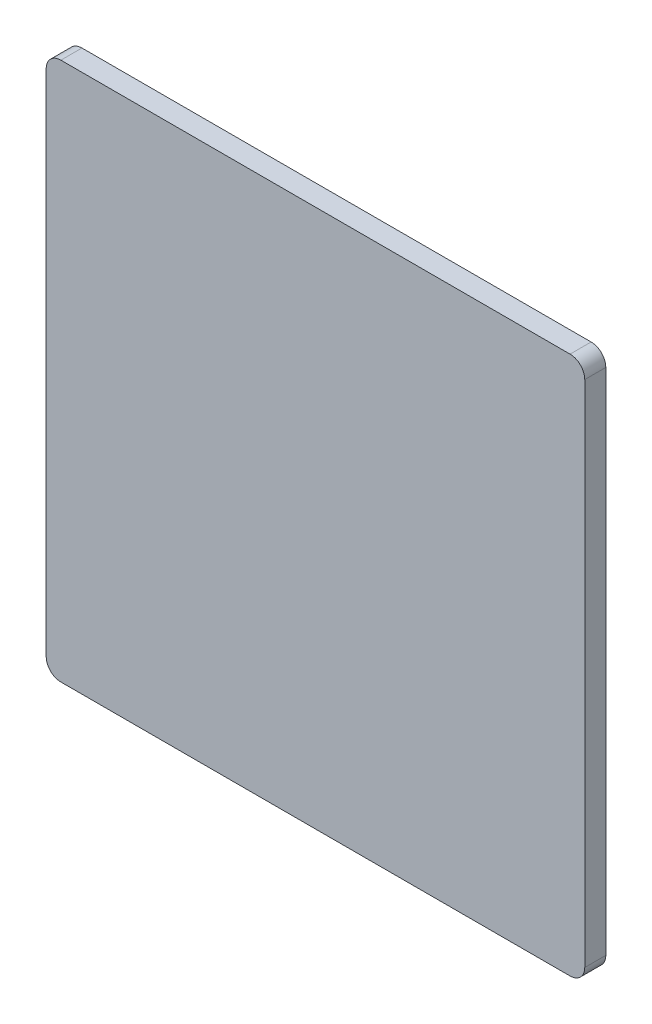
ISO-10303-21;
HEADER;
FILE_DESCRIPTION(('STEP AP214'),'2;1');
FILE_NAME('part.step','',(''),(''),'','','');
FILE_SCHEMA(('AUTOMOTIVE_DESIGN { 1 0 10303 214 1 1 1 1 }'));
ENDSEC;
DATA;
#1=APPLICATION_CONTEXT('core data for automotive mechanical design processes');
#2=APPLICATION_PROTOCOL_DEFINITION('international standard','automotive_design',2000,#1);
#3=PRODUCT_CONTEXT('',#1,'mechanical');
#4=PRODUCT('Part','Part','',(#3));
#5=PRODUCT_RELATED_PRODUCT_CATEGORY('part','',(#4));
#6=PRODUCT_DEFINITION_FORMATION('','',#4);
#7=PRODUCT_DEFINITION_CONTEXT('part definition',#1,'design');
#8=PRODUCT_DEFINITION('design','',#6,#7);
#9=PRODUCT_DEFINITION_SHAPE('','',#8);
#10=(LENGTH_UNIT() NAMED_UNIT(*) SI_UNIT(.MILLI.,.METRE.));
#11=(NAMED_UNIT(*) PLANE_ANGLE_UNIT() SI_UNIT($,.RADIAN.));
#12=(NAMED_UNIT(*) SI_UNIT($,.STERADIAN.) SOLID_ANGLE_UNIT());
#13=UNCERTAINTY_MEASURE_WITH_UNIT(LENGTH_MEASURE(1.E-05),#10,'distance_accuracy_value','');
#14=(GEOMETRIC_REPRESENTATION_CONTEXT(3) GLOBAL_UNCERTAINTY_ASSIGNED_CONTEXT((#13)) GLOBAL_UNIT_ASSIGNED_CONTEXT((#10,
#11,#12)) REPRESENTATION_CONTEXT('',''));
#15=CARTESIAN_POINT('',(0.,0.,0.));
#16=DIRECTION('',(0.,0.,1.));
#17=DIRECTION('',(1.,0.,0.));
#18=AXIS2_PLACEMENT_3D('',#15,#16,#17);
#19=CARTESIAN_POINT('',(55.,55.,4.3));
#20=DIRECTION('',(-1.,0.,0.));
#21=DIRECTION('',(0.,-1.,0.));
#22=AXIS2_PLACEMENT_3D('',#19,#20,#21);
#23=PLANE('',#22);
#24=DIRECTION('',(0.,1.,0.));
#25=VECTOR('',#24,1.);
#26=CARTESIAN_POINT('',(55.,55.,4.3));
#27=LINE('',#26,#25);
#28=CARTESIAN_POINT('',(55.,-52.,4.3));
#29=VERTEX_POINT('',#28);
#30=CARTESIAN_POINT('',(55.,52.,4.3));
#31=VERTEX_POINT('',#30);
#32=EDGE_CURVE('E129',#29,#31,#27,.T.);
#33=ORIENTED_EDGE('',*,*,#32,.F.);
#34=DIRECTION('',(0.,0.,-1.));
#35=VECTOR('',#34,1.);
#36=CARTESIAN_POINT('',(55.,-52.,4.3));
#37=LINE('',#36,#35);
#38=CARTESIAN_POINT('',(55.,-52.,0.));
#39=VERTEX_POINT('',#38);
#40=EDGE_CURVE('E113',#29,#39,#37,.T.);
#41=ORIENTED_EDGE('',*,*,#40,.T.);
#42=DIRECTION('',(0.,1.,0.));
#43=VECTOR('',#42,1.);
#44=CARTESIAN_POINT('',(55.,55.,0.));
#45=LINE('',#44,#43);
#46=CARTESIAN_POINT('',(55.,52.,0.));
#47=VERTEX_POINT('',#46);
#48=EDGE_CURVE('E126',#39,#47,#45,.T.);
#49=ORIENTED_EDGE('',*,*,#48,.T.);
#50=DIRECTION('',(0.,0.,-1.));
#51=VECTOR('',#50,1.);
#52=CARTESIAN_POINT('',(55.,52.,4.3));
#53=LINE('',#52,#51);
#54=EDGE_CURVE('E132',#47,#31,#53,.F.);
#55=ORIENTED_EDGE('',*,*,#54,.T.);
#56=EDGE_LOOP('',(#33,#41,#49,#55));
#57=FACE_BOUND('',#56,.T.);
#58=ADVANCED_FACE('F41',(#57),#23,.F.);
#59=CARTESIAN_POINT('',(-55.,55.,4.3));
#60=DIRECTION('',(0.,-1.,0.));
#61=DIRECTION('',(0.,0.,-1.));
#62=AXIS2_PLACEMENT_3D('',#59,#60,#61);
#63=PLANE('',#62);
#64=DIRECTION('',(-1.,0.,0.));
#65=VECTOR('',#64,1.);
#66=CARTESIAN_POINT('',(-55.,55.,4.3));
#67=LINE('',#66,#65);
#68=CARTESIAN_POINT('',(52.,55.,4.3));
#69=VERTEX_POINT('',#68);
#70=CARTESIAN_POINT('',(-52.,55.,4.3));
#71=VERTEX_POINT('',#70);
#72=EDGE_CURVE('E187',#69,#71,#67,.T.);
#73=ORIENTED_EDGE('',*,*,#72,.F.);
#74=DIRECTION('',(0.,0.,-1.));
#75=VECTOR('',#74,1.);
#76=CARTESIAN_POINT('',(52.,55.,4.3));
#77=LINE('',#76,#75);
#78=CARTESIAN_POINT('',(52.,55.,0.));
#79=VERTEX_POINT('',#78);
#80=EDGE_CURVE('E11',#69,#79,#77,.T.);
#81=ORIENTED_EDGE('',*,*,#80,.T.);
#82=DIRECTION('',(-1.,0.,0.));
#83=VECTOR('',#82,1.);
#84=CARTESIAN_POINT('',(-55.,55.,0.));
#85=LINE('',#84,#83);
#86=CARTESIAN_POINT('',(-52.,55.,0.));
#87=VERTEX_POINT('',#86);
#88=EDGE_CURVE('E138',#79,#87,#85,.T.);
#89=ORIENTED_EDGE('',*,*,#88,.T.);
#90=DIRECTION('',(0.,0.,-1.));
#91=VECTOR('',#90,1.);
#92=CARTESIAN_POINT('',(-52.,55.,4.3));
#93=LINE('',#92,#91);
#94=EDGE_CURVE('E50',#87,#71,#93,.F.);
#95=ORIENTED_EDGE('',*,*,#94,.T.);
#96=EDGE_LOOP('',(#73,#81,#89,#95));
#97=FACE_BOUND('',#96,.T.);
#98=ADVANCED_FACE('F186',(#97),#63,.F.);
#99=CARTESIAN_POINT('',(-55.,55.,4.3));
#100=DIRECTION('',(1.,0.,0.));
#101=DIRECTION('',(0.,1.,0.));
#102=AXIS2_PLACEMENT_3D('',#99,#100,#101);
#103=PLANE('',#102);
#104=DIRECTION('',(0.,-1.,0.));
#105=VECTOR('',#104,1.);
#106=CARTESIAN_POINT('',(-55.,55.,0.));
#107=LINE('',#106,#105);
#108=CARTESIAN_POINT('',(-55.,52.,0.));
#109=VERTEX_POINT('',#108);
#110=CARTESIAN_POINT('',(-55.,-52.,0.));
#111=VERTEX_POINT('',#110);
#112=EDGE_CURVE('E142',#109,#111,#107,.T.);
#113=ORIENTED_EDGE('',*,*,#112,.T.);
#114=DIRECTION('',(0.,0.,-1.));
#115=VECTOR('',#114,1.);
#116=CARTESIAN_POINT('',(-55.,-52.,4.3));
#117=LINE('',#116,#115);
#118=CARTESIAN_POINT('',(-55.,-52.,4.3));
#119=VERTEX_POINT('',#118);
#120=EDGE_CURVE('E57',#111,#119,#117,.F.);
#121=ORIENTED_EDGE('',*,*,#120,.T.);
#122=DIRECTION('',(0.,-1.,0.));
#123=VECTOR('',#122,1.);
#124=CARTESIAN_POINT('',(-55.,55.,4.3));
#125=LINE('',#124,#123);
#126=CARTESIAN_POINT('',(-55.,52.,4.3));
#127=VERTEX_POINT('',#126);
#128=EDGE_CURVE('E194',#127,#119,#125,.T.);
#129=ORIENTED_EDGE('',*,*,#128,.F.);
#130=DIRECTION('',(0.,0.,-1.));
#131=VECTOR('',#130,1.);
#132=CARTESIAN_POINT('',(-55.,52.,4.3));
#133=LINE('',#132,#131);
#134=EDGE_CURVE('E177',#127,#109,#133,.T.);
#135=ORIENTED_EDGE('',*,*,#134,.T.);
#136=EDGE_LOOP('',(#113,#121,#129,#135));
#137=FACE_BOUND('',#136,.T.);
#138=ADVANCED_FACE('F198',(#137),#103,.F.);
#139=CARTESIAN_POINT('',(-55.,-55.,4.3));
#140=DIRECTION('',(0.,1.,0.));
#141=DIRECTION('',(0.,0.,1.));
#142=AXIS2_PLACEMENT_3D('',#139,#140,#141);
#143=PLANE('',#142);
#144=DIRECTION('',(1.,0.,0.));
#145=VECTOR('',#144,1.);
#146=CARTESIAN_POINT('',(-55.,-55.,0.));
#147=LINE('',#146,#145);
#148=CARTESIAN_POINT('',(-52.,-55.,0.));
#149=VERTEX_POINT('',#148);
#150=CARTESIAN_POINT('',(52.,-55.,0.));
#151=VERTEX_POINT('',#150);
#152=EDGE_CURVE('E150',#149,#151,#147,.T.);
#153=ORIENTED_EDGE('',*,*,#152,.T.);
#154=DIRECTION('',(0.,0.,-1.));
#155=VECTOR('',#154,1.);
#156=CARTESIAN_POINT('',(52.,-55.,4.3));
#157=LINE('',#156,#155);
#158=CARTESIAN_POINT('',(52.,-55.,4.3));
#159=VERTEX_POINT('',#158);
#160=EDGE_CURVE('E114',#151,#159,#157,.F.);
#161=ORIENTED_EDGE('',*,*,#160,.T.);
#162=DIRECTION('',(1.,0.,0.));
#163=VECTOR('',#162,1.);
#164=CARTESIAN_POINT('',(-55.,-55.,4.3));
#165=LINE('',#164,#163);
#166=CARTESIAN_POINT('',(-52.,-55.,4.3));
#167=VERTEX_POINT('',#166);
#168=EDGE_CURVE('E145',#167,#159,#165,.T.);
#169=ORIENTED_EDGE('',*,*,#168,.F.);
#170=DIRECTION('',(0.,0.,-1.));
#171=VECTOR('',#170,1.);
#172=CARTESIAN_POINT('',(-52.,-55.,4.3));
#173=LINE('',#172,#171);
#174=EDGE_CURVE('E120',#167,#149,#173,.T.);
#175=ORIENTED_EDGE('',*,*,#174,.T.);
#176=EDGE_LOOP('',(#153,#161,#169,#175));
#177=FACE_BOUND('',#176,.T.);
#178=ADVANCED_FACE('F205',(#177),#143,.F.);
#179=CARTESIAN_POINT('',(0.,0.,4.3));
#180=DIRECTION('',(0.,0.,1.));
#181=DIRECTION('',(1.,0.,0.));
#182=AXIS2_PLACEMENT_3D('',#179,#180,#181);
#183=PLANE('',#182);
#184=ORIENTED_EDGE('',*,*,#168,.T.);
#185=CARTESIAN_POINT('',(52.,-52.,4.3));
#186=DIRECTION('',(0.,0.,1.));
#187=DIRECTION('',(1.,0.,0.));
#188=AXIS2_PLACEMENT_3D('',#185,#186,#187);
#189=CIRCLE('',#188,3.);
#190=EDGE_CURVE('E174',#159,#29,#189,.T.);
#191=ORIENTED_EDGE('',*,*,#190,.T.);
#192=ORIENTED_EDGE('',*,*,#32,.T.);
#193=CARTESIAN_POINT('',(52.,52.,4.3));
#194=DIRECTION('',(0.,0.,1.));
#195=DIRECTION('',(1.,0.,0.));
#196=AXIS2_PLACEMENT_3D('',#193,#194,#195);
#197=CIRCLE('',#196,3.);
#198=EDGE_CURVE('E168',#31,#69,#197,.T.);
#199=ORIENTED_EDGE('',*,*,#198,.T.);
#200=ORIENTED_EDGE('',*,*,#72,.T.);
#201=CARTESIAN_POINT('',(-52.,52.,4.3));
#202=DIRECTION('',(0.,0.,1.));
#203=DIRECTION('',(1.,0.,0.));
#204=AXIS2_PLACEMENT_3D('',#201,#202,#203);
#205=CIRCLE('',#204,3.);
#206=EDGE_CURVE('E64',#71,#127,#205,.T.);
#207=ORIENTED_EDGE('',*,*,#206,.T.);
#208=ORIENTED_EDGE('',*,*,#128,.T.);
#209=CARTESIAN_POINT('',(-52.,-52.,4.3));
#210=DIRECTION('',(0.,0.,1.));
#211=DIRECTION('',(1.,0.,0.));
#212=AXIS2_PLACEMENT_3D('',#209,#210,#211);
#213=CIRCLE('',#212,3.);
#214=EDGE_CURVE('E171',#119,#167,#213,.T.);
#215=ORIENTED_EDGE('',*,*,#214,.T.);
#216=EDGE_LOOP('',(#184,#191,#192,#199,#200,#207,#208,#215));
#217=FACE_BOUND('',#216,.T.);
#218=ADVANCED_FACE('F191',(#217),#183,.T.);
#219=CARTESIAN_POINT('',(0.,0.,0.));
#220=DIRECTION('',(0.,0.,1.));
#221=DIRECTION('',(1.,0.,0.));
#222=AXIS2_PLACEMENT_3D('',#219,#220,#221);
#223=PLANE('',#222);
#224=ORIENTED_EDGE('',*,*,#48,.F.);
#225=CARTESIAN_POINT('',(52.,-52.,0.));
#226=DIRECTION('',(0.,0.,1.));
#227=DIRECTION('',(1.,0.,0.));
#228=AXIS2_PLACEMENT_3D('',#225,#226,#227);
#229=CIRCLE('',#228,3.);
#230=EDGE_CURVE('E109',#39,#151,#229,.F.);
#231=ORIENTED_EDGE('',*,*,#230,.T.);
#232=ORIENTED_EDGE('',*,*,#152,.F.);
#233=CARTESIAN_POINT('',(-52.,-52.,0.));
#234=DIRECTION('',(0.,0.,1.));
#235=DIRECTION('',(1.,0.,0.));
#236=AXIS2_PLACEMENT_3D('',#233,#234,#235);
#237=CIRCLE('',#236,3.);
#238=EDGE_CURVE('E121',#149,#111,#237,.F.);
#239=ORIENTED_EDGE('',*,*,#238,.T.);
#240=ORIENTED_EDGE('',*,*,#112,.F.);
#241=CARTESIAN_POINT('',(-52.,52.,0.));
#242=DIRECTION('',(0.,0.,1.));
#243=DIRECTION('',(1.,0.,0.));
#244=AXIS2_PLACEMENT_3D('',#241,#242,#243);
#245=CIRCLE('',#244,3.);
#246=EDGE_CURVE('E131',#109,#87,#245,.F.);
#247=ORIENTED_EDGE('',*,*,#246,.T.);
#248=ORIENTED_EDGE('',*,*,#88,.F.);
#249=CARTESIAN_POINT('',(52.,52.,0.));
#250=DIRECTION('',(0.,0.,1.));
#251=DIRECTION('',(1.,0.,0.));
#252=AXIS2_PLACEMENT_3D('',#249,#250,#251);
#253=CIRCLE('',#252,3.);
#254=EDGE_CURVE('E136',#79,#47,#253,.F.);
#255=ORIENTED_EDGE('',*,*,#254,.T.);
#256=EDGE_LOOP('',(#224,#231,#232,#239,#240,#247,#248,#255));
#257=FACE_BOUND('',#256,.T.);
#258=ADVANCED_FACE('F134',(#257),#223,.F.);
#259=CARTESIAN_POINT('',(52.,-52.,4.3));
#260=DIRECTION('',(0.,0.,-1.));
#261=DIRECTION('',(-1.,0.,0.));
#262=AXIS2_PLACEMENT_3D('',#259,#260,#261);
#263=CYLINDRICAL_SURFACE('',#262,3.);
#264=ORIENTED_EDGE('',*,*,#190,.F.);
#265=ORIENTED_EDGE('',*,*,#160,.F.);
#266=ORIENTED_EDGE('',*,*,#230,.F.);
#267=ORIENTED_EDGE('',*,*,#40,.F.);
#268=EDGE_LOOP('',(#264,#265,#266,#267));
#269=FACE_BOUND('',#268,.T.);
#270=ADVANCED_FACE('F112',(#269),#263,.T.);
#271=CARTESIAN_POINT('',(-52.,-52.,4.3));
#272=DIRECTION('',(0.,0.,-1.));
#273=DIRECTION('',(-1.,0.,0.));
#274=AXIS2_PLACEMENT_3D('',#271,#272,#273);
#275=CYLINDRICAL_SURFACE('',#274,3.);
#276=ORIENTED_EDGE('',*,*,#214,.F.);
#277=ORIENTED_EDGE('',*,*,#120,.F.);
#278=ORIENTED_EDGE('',*,*,#238,.F.);
#279=ORIENTED_EDGE('',*,*,#174,.F.);
#280=EDGE_LOOP('',(#276,#277,#278,#279));
#281=FACE_BOUND('',#280,.T.);
#282=ADVANCED_FACE('F202',(#281),#275,.T.);
#283=CARTESIAN_POINT('',(52.,52.,4.3));
#284=DIRECTION('',(0.,0.,-1.));
#285=DIRECTION('',(-1.,0.,0.));
#286=AXIS2_PLACEMENT_3D('',#283,#284,#285);
#287=CYLINDRICAL_SURFACE('',#286,3.);
#288=ORIENTED_EDGE('',*,*,#198,.F.);
#289=ORIENTED_EDGE('',*,*,#54,.F.);
#290=ORIENTED_EDGE('',*,*,#254,.F.);
#291=ORIENTED_EDGE('',*,*,#80,.F.);
#292=EDGE_LOOP('',(#288,#289,#290,#291));
#293=FACE_BOUND('',#292,.T.);
#294=ADVANCED_FACE('F211',(#293),#287,.T.);
#295=CARTESIAN_POINT('',(-52.,52.,4.3));
#296=DIRECTION('',(0.,0.,-1.));
#297=DIRECTION('',(-1.,0.,0.));
#298=AXIS2_PLACEMENT_3D('',#295,#296,#297);
#299=CYLINDRICAL_SURFACE('',#298,3.);
#300=ORIENTED_EDGE('',*,*,#206,.F.);
#301=ORIENTED_EDGE('',*,*,#94,.F.);
#302=ORIENTED_EDGE('',*,*,#246,.F.);
#303=ORIENTED_EDGE('',*,*,#134,.F.);
#304=EDGE_LOOP('',(#300,#301,#302,#303));
#305=FACE_BOUND('',#304,.T.);
#306=ADVANCED_FACE('F43',(#305),#299,.T.);
#307=CLOSED_SHELL('',(#58,#98,#138,#178,#218,#258,#270,#282,#294,#306));
#308=MANIFOLD_SOLID_BREP('B2',#307);
#309=ADVANCED_BREP_SHAPE_REPRESENTATION('',(#18,#308),#14);
#310=SHAPE_DEFINITION_REPRESENTATION(#9,#309);
ENDSEC;
END-ISO-10303-21;
